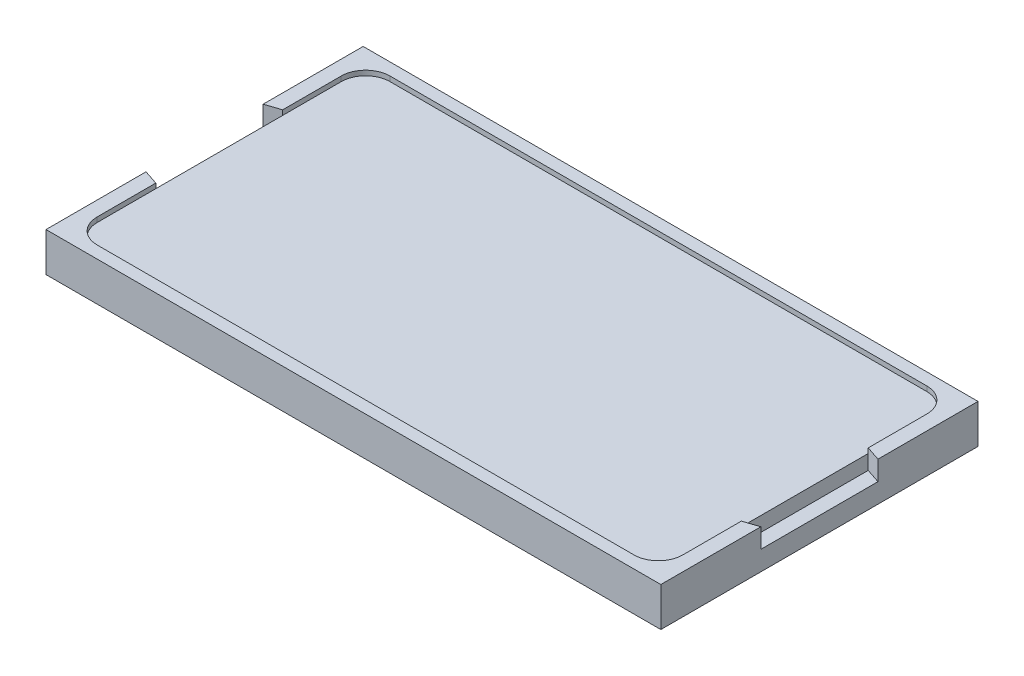
ISO-10303-21;
HEADER;
FILE_DESCRIPTION(('STEP AP214'),'2;1');
FILE_NAME('part.step','',(''),(''),'','','');
FILE_SCHEMA(('AUTOMOTIVE_DESIGN { 1 0 10303 214 1 1 1 1 }'));
ENDSEC;
DATA;
#1=APPLICATION_CONTEXT('core data for automotive mechanical design processes');
#2=APPLICATION_PROTOCOL_DEFINITION('international standard','automotive_design',2000,#1);
#3=PRODUCT_CONTEXT('',#1,'mechanical');
#4=PRODUCT('Part','Part','',(#3));
#5=PRODUCT_RELATED_PRODUCT_CATEGORY('part','',(#4));
#6=PRODUCT_DEFINITION_FORMATION('','',#4);
#7=PRODUCT_DEFINITION_CONTEXT('part definition',#1,'design');
#8=PRODUCT_DEFINITION('design','',#6,#7);
#9=PRODUCT_DEFINITION_SHAPE('','',#8);
#10=(LENGTH_UNIT() NAMED_UNIT(*) SI_UNIT(.MILLI.,.METRE.));
#11=(NAMED_UNIT(*) PLANE_ANGLE_UNIT() SI_UNIT($,.RADIAN.));
#12=(NAMED_UNIT(*) SI_UNIT($,.STERADIAN.) SOLID_ANGLE_UNIT());
#13=UNCERTAINTY_MEASURE_WITH_UNIT(LENGTH_MEASURE(1.E-05),#10,'distance_accuracy_value','');
#14=(GEOMETRIC_REPRESENTATION_CONTEXT(3) GLOBAL_UNCERTAINTY_ASSIGNED_CONTEXT((#13)) GLOBAL_UNIT_ASSIGNED_CONTEXT((#10,
#11,#12)) REPRESENTATION_CONTEXT('',''));
#15=CARTESIAN_POINT('',(0.,0.,0.));
#16=DIRECTION('',(0.,0.,1.));
#17=DIRECTION('',(1.,0.,0.));
#18=AXIS2_PLACEMENT_3D('',#15,#16,#17);
#19=CARTESIAN_POINT('',(0.,88.9,0.));
#20=DIRECTION('',(0.,1.,0.));
#21=DIRECTION('',(0.,0.,1.));
#22=AXIS2_PLACEMENT_3D('',#19,#20,#21);
#23=PLANE('',#22);
#24=CARTESIAN_POINT('',(698.5,88.9,317.5));
#25=DIRECTION('',(0.,1.,0.));
#26=DIRECTION('',(0.,0.,1.));
#27=AXIS2_PLACEMENT_3D('',#24,#25,#26);
#28=CIRCLE('',#27,63.5);
#29=CARTESIAN_POINT('',(698.5,88.9,381.));
#30=VERTEX_POINT('',#29);
#31=CARTESIAN_POINT('',(762.,88.9,317.5));
#32=VERTEX_POINT('',#31);
#33=EDGE_CURVE('E191',#30,#32,#28,.T.);
#34=ORIENTED_EDGE('',*,*,#33,.T.);
#35=DIRECTION('',(0.,0.,1.));
#36=VECTOR('',#35,1.);
#37=CARTESIAN_POINT('',(762.,88.9,-381.));
#38=LINE('',#37,#36);
#39=CARTESIAN_POINT('',(762.,88.9,165.1));
#40=VERTEX_POINT('',#39);
#41=EDGE_CURVE('E218',#40,#32,#38,.T.);
#42=ORIENTED_EDGE('',*,*,#41,.F.);
#43=CARTESIAN_POINT('',(762.,88.9,-165.1));
#44=VERTEX_POINT('',#43);
#45=EDGE_CURVE('E223',#44,#40,#38,.T.);
#46=ORIENTED_EDGE('',*,*,#45,.F.);
#47=CARTESIAN_POINT('',(762.,88.9,-317.5));
#48=VERTEX_POINT('',#47);
#49=EDGE_CURVE('E225',#48,#44,#38,.T.);
#50=ORIENTED_EDGE('',*,*,#49,.F.);
#51=CARTESIAN_POINT('',(698.5,88.9,-317.5));
#52=DIRECTION('',(0.,-1.,0.));
#53=DIRECTION('',(0.,0.,-1.));
#54=AXIS2_PLACEMENT_3D('',#51,#52,#53);
#55=CIRCLE('',#54,63.5);
#56=CARTESIAN_POINT('',(698.5,88.9,-381.));
#57=VERTEX_POINT('',#56);
#58=EDGE_CURVE('E437',#57,#48,#55,.T.);
#59=ORIENTED_EDGE('',*,*,#58,.F.);
#60=DIRECTION('',(1.,0.,0.));
#61=VECTOR('',#60,1.);
#62=CARTESIAN_POINT('',(-762.,88.9,-381.));
#63=LINE('',#62,#61);
#64=CARTESIAN_POINT('',(-698.5,88.9,-381.));
#65=VERTEX_POINT('',#64);
#66=EDGE_CURVE('E232',#65,#57,#63,.T.);
#67=ORIENTED_EDGE('',*,*,#66,.F.);
#68=CARTESIAN_POINT('',(-698.5,88.9,-317.5));
#69=DIRECTION('',(0.,1.,0.));
#70=DIRECTION('',(0.,0.,1.));
#71=AXIS2_PLACEMENT_3D('',#68,#69,#70);
#72=CIRCLE('',#71,63.5);
#73=CARTESIAN_POINT('',(-762.,88.9,-317.5));
#74=VERTEX_POINT('',#73);
#75=EDGE_CURVE('E424',#65,#74,#72,.T.);
#76=ORIENTED_EDGE('',*,*,#75,.T.);
#77=DIRECTION('',(0.,0.,1.));
#78=VECTOR('',#77,1.);
#79=CARTESIAN_POINT('',(-762.,88.9,-381.));
#80=LINE('',#79,#78);
#81=CARTESIAN_POINT('',(-762.,88.9,-165.1));
#82=VERTEX_POINT('',#81);
#83=EDGE_CURVE('E219',#74,#82,#80,.T.);
#84=ORIENTED_EDGE('',*,*,#83,.T.);
#85=CARTESIAN_POINT('',(-762.,88.9,165.1));
#86=VERTEX_POINT('',#85);
#87=EDGE_CURVE('E226',#82,#86,#80,.T.);
#88=ORIENTED_EDGE('',*,*,#87,.T.);
#89=CARTESIAN_POINT('',(-762.,88.9,317.5));
#90=VERTEX_POINT('',#89);
#91=EDGE_CURVE('E228',#86,#90,#80,.T.);
#92=ORIENTED_EDGE('',*,*,#91,.T.);
#93=CARTESIAN_POINT('',(-698.5,88.9,317.5));
#94=DIRECTION('',(0.,-1.,0.));
#95=DIRECTION('',(0.,0.,-1.));
#96=AXIS2_PLACEMENT_3D('',#93,#94,#95);
#97=CIRCLE('',#96,63.5);
#98=CARTESIAN_POINT('',(-698.5,88.9,381.));
#99=VERTEX_POINT('',#98);
#100=EDGE_CURVE('E216',#99,#90,#97,.T.);
#101=ORIENTED_EDGE('',*,*,#100,.F.);
#102=DIRECTION('',(1.,0.,0.));
#103=VECTOR('',#102,1.);
#104=CARTESIAN_POINT('',(-762.,88.9,381.));
#105=LINE('',#104,#103);
#106=EDGE_CURVE('E210',#99,#30,#105,.T.);
#107=ORIENTED_EDGE('',*,*,#106,.T.);
#108=EDGE_LOOP('',(#34,#42,#46,#50,#59,#67,#76,#84,#88,#92,#101,#107));
#109=FACE_BOUND('',#108,.T.);
#110=ADVANCED_FACE('F41',(#109),#23,.T.);
#111=CARTESIAN_POINT('',(-762.,88.9,381.));
#112=DIRECTION('',(0.,0.,1.));
#113=DIRECTION('',(1.,0.,0.));
#114=AXIS2_PLACEMENT_3D('',#111,#112,#113);
#115=PLANE('',#114);
#116=DIRECTION('',(0.,-1.,0.));
#117=VECTOR('',#116,1.);
#118=CARTESIAN_POINT('',(698.5,101.6,381.));
#119=LINE('',#118,#117);
#120=CARTESIAN_POINT('',(698.5,101.6,381.));
#121=VERTEX_POINT('',#120);
#122=EDGE_CURVE('E194',#121,#30,#119,.T.);
#123=ORIENTED_EDGE('',*,*,#122,.T.);
#124=ORIENTED_EDGE('',*,*,#106,.F.);
#125=DIRECTION('',(0.,-1.,0.));
#126=VECTOR('',#125,1.);
#127=CARTESIAN_POINT('',(-698.5,101.6,381.));
#128=LINE('',#127,#126);
#129=CARTESIAN_POINT('',(-698.5,101.6,381.));
#130=VERTEX_POINT('',#129);
#131=EDGE_CURVE('E65',#130,#99,#128,.T.);
#132=ORIENTED_EDGE('',*,*,#131,.F.);
#133=DIRECTION('',(1.,0.,0.));
#134=VECTOR('',#133,1.);
#135=CARTESIAN_POINT('',(-762.,101.6,381.));
#136=LINE('',#135,#134);
#137=EDGE_CURVE('E212',#130,#121,#136,.T.);
#138=ORIENTED_EDGE('',*,*,#137,.T.);
#139=EDGE_LOOP('',(#123,#124,#132,#138));
#140=FACE_BOUND('',#139,.T.);
#141=ADVANCED_FACE('F209',(#140),#115,.F.);
#142=CARTESIAN_POINT('',(762.,88.9,-381.));
#143=DIRECTION('',(-1.,0.,0.));
#144=DIRECTION('',(0.,0.,1.));
#145=AXIS2_PLACEMENT_3D('',#142,#143,#144);
#146=PLANE('',#145);
#147=ORIENTED_EDGE('',*,*,#41,.T.);
#148=DIRECTION('',(0.,-1.,0.));
#149=VECTOR('',#148,1.);
#150=CARTESIAN_POINT('',(762.,101.6,317.5));
#151=LINE('',#150,#149);
#152=CARTESIAN_POINT('',(762.,101.6,317.5));
#153=VERTEX_POINT('',#152);
#154=EDGE_CURVE('E197',#153,#32,#151,.T.);
#155=ORIENTED_EDGE('',*,*,#154,.F.);
#156=DIRECTION('',(0.,0.,1.));
#157=VECTOR('',#156,1.);
#158=CARTESIAN_POINT('',(762.,101.6,-381.));
#159=LINE('',#158,#157);
#160=CARTESIAN_POINT('',(762.,101.6,165.1));
#161=VERTEX_POINT('',#160);
#162=EDGE_CURVE('E243',#161,#153,#159,.T.);
#163=ORIENTED_EDGE('',*,*,#162,.F.);
#164=DIRECTION('',(0.,1.,0.));
#165=VECTOR('',#164,1.);
#166=CARTESIAN_POINT('',(762.,50.8,165.1));
#167=LINE('',#166,#165);
#168=EDGE_CURVE('E340',#40,#161,#167,.T.);
#169=ORIENTED_EDGE('',*,*,#168,.F.);
#170=EDGE_LOOP('',(#147,#155,#163,#169));
#171=FACE_BOUND('',#170,.T.);
#172=ADVANCED_FACE('F346',(#171),#146,.T.);
#173=CARTESIAN_POINT('',(762.,101.6,-317.5));
#174=VERTEX_POINT('',#173);
#175=CARTESIAN_POINT('',(762.,101.6,-165.1));
#176=VERTEX_POINT('',#175);
#177=EDGE_CURVE('E244',#174,#176,#159,.T.);
#178=ORIENTED_EDGE('',*,*,#177,.F.);
#179=DIRECTION('',(0.,-1.,0.));
#180=VECTOR('',#179,1.);
#181=CARTESIAN_POINT('',(762.,101.6,-317.5));
#182=LINE('',#181,#180);
#183=EDGE_CURVE('E443',#174,#48,#182,.T.);
#184=ORIENTED_EDGE('',*,*,#183,.T.);
#185=ORIENTED_EDGE('',*,*,#49,.T.);
#186=DIRECTION('',(0.,1.,0.));
#187=VECTOR('',#186,1.);
#188=CARTESIAN_POINT('',(762.,50.8,-165.1));
#189=LINE('',#188,#187);
#190=EDGE_CURVE('E349',#44,#176,#189,.T.);
#191=ORIENTED_EDGE('',*,*,#190,.T.);
#192=EDGE_LOOP('',(#178,#184,#185,#191));
#193=FACE_BOUND('',#192,.T.);
#194=ADVANCED_FACE('F492',(#193),#146,.T.);
#195=CARTESIAN_POINT('',(0.,101.6,0.));
#196=DIRECTION('',(0.,1.,0.));
#197=DIRECTION('',(0.,0.,1.));
#198=AXIS2_PLACEMENT_3D('',#195,#196,#197);
#199=PLANE('',#198);
#200=CARTESIAN_POINT('',(698.5,101.6,-317.5));
#201=DIRECTION('',(0.,-1.,0.));
#202=DIRECTION('',(0.,0.,-1.));
#203=AXIS2_PLACEMENT_3D('',#200,#201,#202);
#204=CIRCLE('',#203,63.5);
#205=CARTESIAN_POINT('',(698.5,101.6,-381.));
#206=VERTEX_POINT('',#205);
#207=EDGE_CURVE('E440',#206,#174,#204,.T.);
#208=ORIENTED_EDGE('',*,*,#207,.T.);
#209=ORIENTED_EDGE('',*,*,#177,.T.);
#210=DIRECTION('',(0.948683298050513,0.,0.316227766016841));
#211=VECTOR('',#210,1.);
#212=CARTESIAN_POINT('',(762.,101.6,-165.1));
#213=LINE('',#212,#211);
#214=CARTESIAN_POINT('',(800.1,101.6,-152.4));
#215=VERTEX_POINT('',#214);
#216=EDGE_CURVE('E371',#176,#215,#213,.T.);
#217=ORIENTED_EDGE('',*,*,#216,.T.);
#218=DIRECTION('',(0.,0.,-1.));
#219=VECTOR('',#218,1.);
#220=CARTESIAN_POINT('',(800.1,101.6,-412.75));
#221=LINE('',#220,#219);
#222=CARTESIAN_POINT('',(800.1,101.6,-412.75));
#223=VERTEX_POINT('',#222);
#224=EDGE_CURVE('E255',#215,#223,#221,.T.);
#225=ORIENTED_EDGE('',*,*,#224,.T.);
#226=DIRECTION('',(-1.,0.,0.));
#227=VECTOR('',#226,1.);
#228=CARTESIAN_POINT('',(-800.1,101.6,-412.75));
#229=LINE('',#228,#227);
#230=CARTESIAN_POINT('',(-800.1,101.6,-412.75));
#231=VERTEX_POINT('',#230);
#232=EDGE_CURVE('E254',#223,#231,#229,.T.);
#233=ORIENTED_EDGE('',*,*,#232,.T.);
#234=DIRECTION('',(0.,0.,1.));
#235=VECTOR('',#234,1.);
#236=CARTESIAN_POINT('',(-800.1,101.6,-412.75));
#237=LINE('',#236,#235);
#238=CARTESIAN_POINT('',(-800.1,101.6,-152.4));
#239=VERTEX_POINT('',#238);
#240=EDGE_CURVE('E259',#231,#239,#237,.T.);
#241=ORIENTED_EDGE('',*,*,#240,.T.);
#242=DIRECTION('',(-0.948683298050515,0.,0.316227766016833));
#243=VECTOR('',#242,1.);
#244=CARTESIAN_POINT('',(-800.1,101.6,-152.4));
#245=LINE('',#244,#243);
#246=CARTESIAN_POINT('',(-762.,101.6,-165.1));
#247=VERTEX_POINT('',#246);
#248=EDGE_CURVE('E396',#247,#239,#245,.T.);
#249=ORIENTED_EDGE('',*,*,#248,.F.);
#250=DIRECTION('',(0.,0.,1.));
#251=VECTOR('',#250,1.);
#252=CARTESIAN_POINT('',(-762.,101.6,-381.));
#253=LINE('',#252,#251);
#254=CARTESIAN_POINT('',(-762.,101.6,-317.5));
#255=VERTEX_POINT('',#254);
#256=EDGE_CURVE('E237',#255,#247,#253,.T.);
#257=ORIENTED_EDGE('',*,*,#256,.F.);
#258=CARTESIAN_POINT('',(-698.5,101.6,-317.5));
#259=DIRECTION('',(0.,1.,0.));
#260=DIRECTION('',(0.,0.,1.));
#261=AXIS2_PLACEMENT_3D('',#258,#259,#260);
#262=CIRCLE('',#261,63.5);
#263=CARTESIAN_POINT('',(-698.5,101.6,-381.));
#264=VERTEX_POINT('',#263);
#265=EDGE_CURVE('E57',#264,#255,#262,.T.);
#266=ORIENTED_EDGE('',*,*,#265,.F.);
#267=DIRECTION('',(1.,0.,0.));
#268=VECTOR('',#267,1.);
#269=CARTESIAN_POINT('',(-762.,101.6,-381.));
#270=LINE('',#269,#268);
#271=EDGE_CURVE('E247',#264,#206,#270,.T.);
#272=ORIENTED_EDGE('',*,*,#271,.T.);
#273=EDGE_LOOP('',(#208,#209,#217,#225,#233,#241,#249,#257,#266,#272));
#274=FACE_BOUND('',#273,.T.);
#275=ADVANCED_FACE('F466',(#274),#199,.T.);
#276=CARTESIAN_POINT('',(-762.,88.9,-381.));
#277=DIRECTION('',(-1.,0.,0.));
#278=DIRECTION('',(0.,0.,1.));
#279=AXIS2_PLACEMENT_3D('',#276,#277,#278);
#280=PLANE('',#279);
#281=ORIENTED_EDGE('',*,*,#83,.F.);
#282=DIRECTION('',(0.,-1.,0.));
#283=VECTOR('',#282,1.);
#284=CARTESIAN_POINT('',(-762.,101.6,-317.5));
#285=LINE('',#284,#283);
#286=EDGE_CURVE('E429',#255,#74,#285,.T.);
#287=ORIENTED_EDGE('',*,*,#286,.F.);
#288=ORIENTED_EDGE('',*,*,#256,.T.);
#289=DIRECTION('',(0.,1.,0.));
#290=VECTOR('',#289,1.);
#291=CARTESIAN_POINT('',(-762.,50.8,-165.1));
#292=LINE('',#291,#290);
#293=EDGE_CURVE('E389',#82,#247,#292,.T.);
#294=ORIENTED_EDGE('',*,*,#293,.F.);
#295=EDGE_LOOP('',(#281,#287,#288,#294));
#296=FACE_BOUND('',#295,.T.);
#297=ADVANCED_FACE('F475',(#296),#280,.F.);
#298=CARTESIAN_POINT('',(800.1,101.6,-412.75));
#299=DIRECTION('',(-1.,0.,0.));
#300=DIRECTION('',(0.,0.,1.));
#301=AXIS2_PLACEMENT_3D('',#298,#299,#300);
#302=PLANE('',#301);
#303=DIRECTION('',(0.,0.,-1.));
#304=VECTOR('',#303,1.);
#305=CARTESIAN_POINT('',(800.1,50.8,152.4));
#306=LINE('',#305,#304);
#307=CARTESIAN_POINT('',(800.1,50.8,152.4));
#308=VERTEX_POINT('',#307);
#309=CARTESIAN_POINT('',(800.1,50.8,-152.4));
#310=VERTEX_POINT('',#309);
#311=EDGE_CURVE('E375',#308,#310,#306,.T.);
#312=ORIENTED_EDGE('',*,*,#311,.F.);
#313=DIRECTION('',(0.,1.,0.));
#314=VECTOR('',#313,1.);
#315=CARTESIAN_POINT('',(800.1,50.8,152.4));
#316=LINE('',#315,#314);
#317=CARTESIAN_POINT('',(800.1,101.6,152.4));
#318=VERTEX_POINT('',#317);
#319=EDGE_CURVE('E310',#308,#318,#316,.T.);
#320=ORIENTED_EDGE('',*,*,#319,.T.);
#321=CARTESIAN_POINT('',(800.1,101.6,412.75));
#322=VERTEX_POINT('',#321);
#323=EDGE_CURVE('E250',#322,#318,#221,.T.);
#324=ORIENTED_EDGE('',*,*,#323,.F.);
#325=DIRECTION('',(0.,-1.,0.));
#326=VECTOR('',#325,1.);
#327=CARTESIAN_POINT('',(800.1,101.6,412.75));
#328=LINE('',#327,#326);
#329=CARTESIAN_POINT('',(800.1,0.,412.75));
#330=VERTEX_POINT('',#329);
#331=EDGE_CURVE('E266',#322,#330,#328,.T.);
#332=ORIENTED_EDGE('',*,*,#331,.T.);
#333=DIRECTION('',(0.,0.,-1.));
#334=VECTOR('',#333,1.);
#335=CARTESIAN_POINT('',(800.1,0.,-412.75));
#336=LINE('',#335,#334);
#337=CARTESIAN_POINT('',(800.1,0.,-412.75));
#338=VERTEX_POINT('',#337);
#339=EDGE_CURVE('E236',#330,#338,#336,.T.);
#340=ORIENTED_EDGE('',*,*,#339,.T.);
#341=DIRECTION('',(0.,-1.,0.));
#342=VECTOR('',#341,1.);
#343=CARTESIAN_POINT('',(800.1,101.6,-412.75));
#344=LINE('',#343,#342);
#345=EDGE_CURVE('E11',#223,#338,#344,.T.);
#346=ORIENTED_EDGE('',*,*,#345,.F.);
#347=ORIENTED_EDGE('',*,*,#224,.F.);
#348=DIRECTION('',(0.,1.,0.));
#349=VECTOR('',#348,1.);
#350=CARTESIAN_POINT('',(800.1,50.8,-152.4));
#351=LINE('',#350,#349);
#352=EDGE_CURVE('E353',#310,#215,#351,.T.);
#353=ORIENTED_EDGE('',*,*,#352,.F.);
#354=EDGE_LOOP('',(#312,#320,#324,#332,#340,#346,#347,#353));
#355=FACE_BOUND('',#354,.T.);
#356=ADVANCED_FACE('F43',(#355),#302,.F.);
#357=CARTESIAN_POINT('',(-800.1,101.6,-412.75));
#358=DIRECTION('',(0.,0.,1.));
#359=DIRECTION('',(1.,0.,0.));
#360=AXIS2_PLACEMENT_3D('',#357,#358,#359);
#361=PLANE('',#360);
#362=DIRECTION('',(-1.,0.,0.));
#363=VECTOR('',#362,1.);
#364=CARTESIAN_POINT('',(-800.1,0.,-412.75));
#365=LINE('',#364,#363);
#366=CARTESIAN_POINT('',(-800.1,0.,-412.75));
#367=VERTEX_POINT('',#366);
#368=EDGE_CURVE('E270',#338,#367,#365,.T.);
#369=ORIENTED_EDGE('',*,*,#368,.T.);
#370=DIRECTION('',(0.,-1.,0.));
#371=VECTOR('',#370,1.);
#372=CARTESIAN_POINT('',(-800.1,101.6,-412.75));
#373=LINE('',#372,#371);
#374=EDGE_CURVE('E50',#231,#367,#373,.T.);
#375=ORIENTED_EDGE('',*,*,#374,.F.);
#376=ORIENTED_EDGE('',*,*,#232,.F.);
#377=ORIENTED_EDGE('',*,*,#345,.T.);
#378=EDGE_LOOP('',(#369,#375,#376,#377));
#379=FACE_BOUND('',#378,.T.);
#380=ADVANCED_FACE('F468',(#379),#361,.F.);
#381=CARTESIAN_POINT('',(-800.1,101.6,-412.75));
#382=DIRECTION('',(1.,0.,0.));
#383=DIRECTION('',(0.,0.,-1.));
#384=AXIS2_PLACEMENT_3D('',#381,#382,#383);
#385=PLANE('',#384);
#386=DIRECTION('',(0.,0.,1.));
#387=VECTOR('',#386,1.);
#388=CARTESIAN_POINT('',(-800.1,50.8,-2.22044604925031E-13));
#389=LINE('',#388,#387);
#390=CARTESIAN_POINT('',(-800.1,50.8,-152.4));
#391=VERTEX_POINT('',#390);
#392=CARTESIAN_POINT('',(-800.1,50.8,152.4));
#393=VERTEX_POINT('',#392);
#394=EDGE_CURVE('E399',#391,#393,#389,.T.);
#395=ORIENTED_EDGE('',*,*,#394,.F.);
#396=DIRECTION('',(0.,1.,0.));
#397=VECTOR('',#396,1.);
#398=CARTESIAN_POINT('',(-800.1,50.8,-152.4));
#399=LINE('',#398,#397);
#400=EDGE_CURVE('E373',#391,#239,#399,.T.);
#401=ORIENTED_EDGE('',*,*,#400,.T.);
#402=ORIENTED_EDGE('',*,*,#240,.F.);
#403=ORIENTED_EDGE('',*,*,#374,.T.);
#404=DIRECTION('',(0.,0.,1.));
#405=VECTOR('',#404,1.);
#406=CARTESIAN_POINT('',(-800.1,0.,-412.75));
#407=LINE('',#406,#405);
#408=CARTESIAN_POINT('',(-800.1,0.,412.75));
#409=VERTEX_POINT('',#408);
#410=EDGE_CURVE('E273',#367,#409,#407,.T.);
#411=ORIENTED_EDGE('',*,*,#410,.T.);
#412=DIRECTION('',(0.,-1.,0.));
#413=VECTOR('',#412,1.);
#414=CARTESIAN_POINT('',(-800.1,101.6,412.75));
#415=LINE('',#414,#413);
#416=CARTESIAN_POINT('',(-800.1,101.6,412.75));
#417=VERTEX_POINT('',#416);
#418=EDGE_CURVE('E282',#417,#409,#415,.T.);
#419=ORIENTED_EDGE('',*,*,#418,.F.);
#420=CARTESIAN_POINT('',(-800.1,101.6,152.4));
#421=VERTEX_POINT('',#420);
#422=EDGE_CURVE('E258',#421,#417,#237,.T.);
#423=ORIENTED_EDGE('',*,*,#422,.F.);
#424=DIRECTION('',(0.,1.,0.));
#425=VECTOR('',#424,1.);
#426=CARTESIAN_POINT('',(-800.1,50.8,152.4));
#427=LINE('',#426,#425);
#428=EDGE_CURVE('E381',#393,#421,#427,.T.);
#429=ORIENTED_EDGE('',*,*,#428,.F.);
#430=EDGE_LOOP('',(#395,#401,#402,#403,#411,#419,#423,#429));
#431=FACE_BOUND('',#430,.T.);
#432=ADVANCED_FACE('F292',(#431),#385,.F.);
#433=CARTESIAN_POINT('',(-800.1,101.6,412.75));
#434=DIRECTION('',(0.,0.,-1.));
#435=DIRECTION('',(-1.,0.,0.));
#436=AXIS2_PLACEMENT_3D('',#433,#434,#435);
#437=PLANE('',#436);
#438=DIRECTION('',(1.,0.,0.));
#439=VECTOR('',#438,1.);
#440=CARTESIAN_POINT('',(-800.1,0.,412.75));
#441=LINE('',#440,#439);
#442=EDGE_CURVE('E276',#409,#330,#441,.T.);
#443=ORIENTED_EDGE('',*,*,#442,.T.);
#444=ORIENTED_EDGE('',*,*,#331,.F.);
#445=DIRECTION('',(1.,0.,0.));
#446=VECTOR('',#445,1.);
#447=CARTESIAN_POINT('',(-800.1,101.6,412.75));
#448=LINE('',#447,#446);
#449=EDGE_CURVE('E263',#417,#322,#448,.T.);
#450=ORIENTED_EDGE('',*,*,#449,.F.);
#451=ORIENTED_EDGE('',*,*,#418,.T.);
#452=EDGE_LOOP('',(#443,#444,#450,#451));
#453=FACE_BOUND('',#452,.T.);
#454=ADVANCED_FACE('F303',(#453),#437,.F.);
#455=CARTESIAN_POINT('',(-698.5,101.6,317.5));
#456=DIRECTION('',(0.,-1.,0.));
#457=DIRECTION('',(0.,0.,-1.));
#458=AXIS2_PLACEMENT_3D('',#455,#456,#457);
#459=CIRCLE('',#458,63.5);
#460=CARTESIAN_POINT('',(-762.,101.6,317.5));
#461=VERTEX_POINT('',#460);
#462=EDGE_CURVE('E419',#130,#461,#459,.T.);
#463=ORIENTED_EDGE('',*,*,#462,.T.);
#464=CARTESIAN_POINT('',(-762.,101.6,165.1));
#465=VERTEX_POINT('',#464);
#466=EDGE_CURVE('E240',#465,#461,#253,.T.);
#467=ORIENTED_EDGE('',*,*,#466,.F.);
#468=DIRECTION('',(0.948683298050515,0.,0.316227766016835));
#469=VECTOR('',#468,1.);
#470=CARTESIAN_POINT('',(-800.1,101.6,152.4));
#471=LINE('',#470,#469);
#472=EDGE_CURVE('E320',#421,#465,#471,.T.);
#473=ORIENTED_EDGE('',*,*,#472,.F.);
#474=ORIENTED_EDGE('',*,*,#422,.T.);
#475=ORIENTED_EDGE('',*,*,#449,.T.);
#476=ORIENTED_EDGE('',*,*,#323,.T.);
#477=DIRECTION('',(0.948683298050513,0.,-0.316227766016841));
#478=VECTOR('',#477,1.);
#479=CARTESIAN_POINT('',(762.,101.6,165.1));
#480=LINE('',#479,#478);
#481=EDGE_CURVE('E315',#161,#318,#480,.T.);
#482=ORIENTED_EDGE('',*,*,#481,.F.);
#483=ORIENTED_EDGE('',*,*,#162,.T.);
#484=CARTESIAN_POINT('',(698.5,101.6,317.5));
#485=DIRECTION('',(0.,1.,0.));
#486=DIRECTION('',(0.,0.,1.));
#487=AXIS2_PLACEMENT_3D('',#484,#485,#486);
#488=CIRCLE('',#487,63.5);
#489=EDGE_CURVE('E204',#121,#153,#488,.T.);
#490=ORIENTED_EDGE('',*,*,#489,.F.);
#491=ORIENTED_EDGE('',*,*,#137,.F.);
#492=EDGE_LOOP('',(#463,#467,#473,#474,#475,#476,#482,#483,#490,#491));
#493=FACE_BOUND('',#492,.T.);
#494=ADVANCED_FACE('F313',(#493),#199,.T.);
#495=CARTESIAN_POINT('',(0.,0.,0.));
#496=DIRECTION('',(0.,1.,0.));
#497=DIRECTION('',(0.,0.,1.));
#498=AXIS2_PLACEMENT_3D('',#495,#496,#497);
#499=PLANE('',#498);
#500=ORIENTED_EDGE('',*,*,#339,.F.);
#501=ORIENTED_EDGE('',*,*,#442,.F.);
#502=ORIENTED_EDGE('',*,*,#410,.F.);
#503=ORIENTED_EDGE('',*,*,#368,.F.);
#504=EDGE_LOOP('',(#500,#501,#502,#503));
#505=FACE_BOUND('',#504,.T.);
#506=ADVANCED_FACE('F300',(#505),#499,.F.);
#507=ORIENTED_EDGE('',*,*,#466,.T.);
#508=DIRECTION('',(0.,-1.,0.));
#509=VECTOR('',#508,1.);
#510=CARTESIAN_POINT('',(-762.,101.6,317.5));
#511=LINE('',#510,#509);
#512=EDGE_CURVE('E415',#461,#90,#511,.T.);
#513=ORIENTED_EDGE('',*,*,#512,.T.);
#514=ORIENTED_EDGE('',*,*,#91,.F.);
#515=DIRECTION('',(0.,1.,0.));
#516=VECTOR('',#515,1.);
#517=CARTESIAN_POINT('',(-762.,50.8,165.1));
#518=LINE('',#517,#516);
#519=EDGE_CURVE('E384',#86,#465,#518,.T.);
#520=ORIENTED_EDGE('',*,*,#519,.T.);
#521=EDGE_LOOP('',(#507,#513,#514,#520));
#522=FACE_BOUND('',#521,.T.);
#523=ADVANCED_FACE('F489',(#522),#280,.F.);
#524=CARTESIAN_POINT('',(-762.,88.9,-381.));
#525=DIRECTION('',(0.,0.,1.));
#526=DIRECTION('',(1.,0.,0.));
#527=AXIS2_PLACEMENT_3D('',#524,#525,#526);
#528=PLANE('',#527);
#529=DIRECTION('',(0.,-1.,0.));
#530=VECTOR('',#529,1.);
#531=CARTESIAN_POINT('',(698.5,101.6,-381.));
#532=LINE('',#531,#530);
#533=EDGE_CURVE('E203',#206,#57,#532,.T.);
#534=ORIENTED_EDGE('',*,*,#533,.F.);
#535=ORIENTED_EDGE('',*,*,#271,.F.);
#536=DIRECTION('',(0.,-1.,0.));
#537=VECTOR('',#536,1.);
#538=CARTESIAN_POINT('',(-698.5,101.6,-381.));
#539=LINE('',#538,#537);
#540=EDGE_CURVE('E433',#264,#65,#539,.T.);
#541=ORIENTED_EDGE('',*,*,#540,.T.);
#542=ORIENTED_EDGE('',*,*,#66,.T.);
#543=EDGE_LOOP('',(#534,#535,#541,#542));
#544=FACE_BOUND('',#543,.T.);
#545=ADVANCED_FACE('F486',(#544),#528,.T.);
#546=CARTESIAN_POINT('',(762.,50.8,165.1));
#547=DIRECTION('',(0.316227766016841,0.,0.948683298050513));
#548=DIRECTION('',(0.948683298050513,0.,-0.316227766016841));
#549=AXIS2_PLACEMENT_3D('',#546,#547,#548);
#550=PLANE('',#549);
#551=ORIENTED_EDGE('',*,*,#481,.T.);
#552=ORIENTED_EDGE('',*,*,#319,.F.);
#553=DIRECTION('',(0.948683298050513,0.,-0.316227766016841));
#554=VECTOR('',#553,1.);
#555=CARTESIAN_POINT('',(762.,50.8,165.1));
#556=LINE('',#555,#554);
#557=CARTESIAN_POINT('',(762.,50.8,165.1));
#558=VERTEX_POINT('',#557);
#559=EDGE_CURVE('E342',#558,#308,#556,.T.);
#560=ORIENTED_EDGE('',*,*,#559,.F.);
#561=EDGE_CURVE('E331',#558,#40,#167,.T.);
#562=ORIENTED_EDGE('',*,*,#561,.T.);
#563=ORIENTED_EDGE('',*,*,#168,.T.);
#564=EDGE_LOOP('',(#551,#552,#560,#562,#563));
#565=FACE_BOUND('',#564,.T.);
#566=ADVANCED_FACE('F339',(#565),#550,.F.);
#567=CARTESIAN_POINT('',(762.,50.8,0.));
#568=DIRECTION('',(-1.,0.,0.));
#569=DIRECTION('',(0.,0.,1.));
#570=AXIS2_PLACEMENT_3D('',#567,#568,#569);
#571=PLANE('',#570);
#572=ORIENTED_EDGE('',*,*,#45,.T.);
#573=ORIENTED_EDGE('',*,*,#561,.F.);
#574=DIRECTION('',(0.,0.,-1.));
#575=VECTOR('',#574,1.);
#576=CARTESIAN_POINT('',(762.,50.8,0.));
#577=LINE('',#576,#575);
#578=CARTESIAN_POINT('',(762.,50.8,-165.1));
#579=VERTEX_POINT('',#578);
#580=EDGE_CURVE('E363',#558,#579,#577,.T.);
#581=ORIENTED_EDGE('',*,*,#580,.T.);
#582=EDGE_CURVE('E334',#579,#44,#189,.T.);
#583=ORIENTED_EDGE('',*,*,#582,.T.);
#584=EDGE_LOOP('',(#572,#573,#581,#583));
#585=FACE_BOUND('',#584,.T.);
#586=ADVANCED_FACE('F330',(#585),#571,.F.);
#587=CARTESIAN_POINT('',(762.,50.8,-165.1));
#588=DIRECTION('',(-0.316227766016841,0.,0.948683298050513));
#589=DIRECTION('',(0.948683298050513,0.,0.316227766016841));
#590=AXIS2_PLACEMENT_3D('',#587,#588,#589);
#591=PLANE('',#590);
#592=ORIENTED_EDGE('',*,*,#216,.F.);
#593=ORIENTED_EDGE('',*,*,#190,.F.);
#594=ORIENTED_EDGE('',*,*,#582,.F.);
#595=DIRECTION('',(0.948683298050513,0.,0.316227766016841));
#596=VECTOR('',#595,1.);
#597=CARTESIAN_POINT('',(762.,50.8,-165.1));
#598=LINE('',#597,#596);
#599=EDGE_CURVE('E367',#579,#310,#598,.T.);
#600=ORIENTED_EDGE('',*,*,#599,.T.);
#601=ORIENTED_EDGE('',*,*,#352,.T.);
#602=EDGE_LOOP('',(#592,#593,#594,#600,#601));
#603=FACE_BOUND('',#602,.T.);
#604=ADVANCED_FACE('F484',(#603),#591,.T.);
#605=CARTESIAN_POINT('',(0.,50.8,0.));
#606=DIRECTION('',(0.,-1.,0.));
#607=DIRECTION('',(0.,0.,-1.));
#608=AXIS2_PLACEMENT_3D('',#605,#606,#607);
#609=PLANE('',#608);
#610=ORIENTED_EDGE('',*,*,#311,.T.);
#611=ORIENTED_EDGE('',*,*,#599,.F.);
#612=ORIENTED_EDGE('',*,*,#580,.F.);
#613=ORIENTED_EDGE('',*,*,#559,.T.);
#614=EDGE_LOOP('',(#610,#611,#612,#613));
#615=FACE_BOUND('',#614,.T.);
#616=ADVANCED_FACE('F544',(#615),#609,.F.);
#617=CARTESIAN_POINT('',(-800.1,50.8,-152.4));
#618=DIRECTION('',(-0.316227766016833,0.,-0.948683298050515));
#619=DIRECTION('',(-0.948683298050516,0.,0.316227766016833));
#620=AXIS2_PLACEMENT_3D('',#617,#618,#619);
#621=PLANE('',#620);
#622=ORIENTED_EDGE('',*,*,#248,.T.);
#623=ORIENTED_EDGE('',*,*,#400,.F.);
#624=DIRECTION('',(-0.948683298050515,0.,0.316227766016833));
#625=VECTOR('',#624,1.);
#626=CARTESIAN_POINT('',(-800.1,50.8,-152.4));
#627=LINE('',#626,#625);
#628=CARTESIAN_POINT('',(-762.,50.8,-165.1));
#629=VERTEX_POINT('',#628);
#630=EDGE_CURVE('E385',#629,#391,#627,.T.);
#631=ORIENTED_EDGE('',*,*,#630,.F.);
#632=EDGE_CURVE('E390',#629,#82,#292,.T.);
#633=ORIENTED_EDGE('',*,*,#632,.T.);
#634=ORIENTED_EDGE('',*,*,#293,.T.);
#635=EDGE_LOOP('',(#622,#623,#631,#633,#634));
#636=FACE_BOUND('',#635,.T.);
#637=ADVANCED_FACE('F461',(#636),#621,.F.);
#638=CARTESIAN_POINT('',(-762.,50.8,0.));
#639=DIRECTION('',(1.,0.,0.));
#640=DIRECTION('',(0.,0.,-1.));
#641=AXIS2_PLACEMENT_3D('',#638,#639,#640);
#642=PLANE('',#641);
#643=ORIENTED_EDGE('',*,*,#87,.F.);
#644=ORIENTED_EDGE('',*,*,#632,.F.);
#645=DIRECTION('',(0.,0.,-1.));
#646=VECTOR('',#645,1.);
#647=CARTESIAN_POINT('',(-762.,50.8,0.));
#648=LINE('',#647,#646);
#649=CARTESIAN_POINT('',(-762.,50.8,165.1));
#650=VERTEX_POINT('',#649);
#651=EDGE_CURVE('E405',#650,#629,#648,.T.);
#652=ORIENTED_EDGE('',*,*,#651,.F.);
#653=EDGE_CURVE('E386',#650,#86,#518,.T.);
#654=ORIENTED_EDGE('',*,*,#653,.T.);
#655=EDGE_LOOP('',(#643,#644,#652,#654));
#656=FACE_BOUND('',#655,.T.);
#657=ADVANCED_FACE('F557',(#656),#642,.F.);
#658=CARTESIAN_POINT('',(-800.1,50.8,152.4));
#659=DIRECTION('',(-0.316227766016835,0.,0.948683298050515));
#660=DIRECTION('',(0.948683298050515,0.,0.316227766016835));
#661=AXIS2_PLACEMENT_3D('',#658,#659,#660);
#662=PLANE('',#661);
#663=ORIENTED_EDGE('',*,*,#472,.T.);
#664=ORIENTED_EDGE('',*,*,#519,.F.);
#665=ORIENTED_EDGE('',*,*,#653,.F.);
#666=DIRECTION('',(0.948683298050515,0.,0.316227766016835));
#667=VECTOR('',#666,1.);
#668=CARTESIAN_POINT('',(-800.1,50.8,152.4));
#669=LINE('',#668,#667);
#670=EDGE_CURVE('E408',#393,#650,#669,.T.);
#671=ORIENTED_EDGE('',*,*,#670,.F.);
#672=ORIENTED_EDGE('',*,*,#428,.T.);
#673=EDGE_LOOP('',(#663,#664,#665,#671,#672));
#674=FACE_BOUND('',#673,.T.);
#675=ADVANCED_FACE('F565',(#674),#662,.F.);
#676=CARTESIAN_POINT('',(0.,50.8,0.));
#677=DIRECTION('',(0.,1.,0.));
#678=DIRECTION('',(0.,0.,1.));
#679=AXIS2_PLACEMENT_3D('',#676,#677,#678);
#680=PLANE('',#679);
#681=ORIENTED_EDGE('',*,*,#394,.T.);
#682=ORIENTED_EDGE('',*,*,#670,.T.);
#683=ORIENTED_EDGE('',*,*,#651,.T.);
#684=ORIENTED_EDGE('',*,*,#630,.T.);
#685=EDGE_LOOP('',(#681,#682,#683,#684));
#686=FACE_BOUND('',#685,.T.);
#687=ADVANCED_FACE('F573',(#686),#680,.T.);
#688=CARTESIAN_POINT('',(-698.5,101.6,317.5));
#689=DIRECTION('',(0.,-1.,0.));
#690=DIRECTION('',(0.,0.,-1.));
#691=AXIS2_PLACEMENT_3D('',#688,#689,#690);
#692=CYLINDRICAL_SURFACE('',#691,63.5);
#693=ORIENTED_EDGE('',*,*,#100,.T.);
#694=ORIENTED_EDGE('',*,*,#512,.F.);
#695=ORIENTED_EDGE('',*,*,#462,.F.);
#696=ORIENTED_EDGE('',*,*,#131,.T.);
#697=EDGE_LOOP('',(#693,#694,#695,#696));
#698=FACE_BOUND('',#697,.T.);
#699=ADVANCED_FACE('F580',(#698),#692,.F.);
#700=CARTESIAN_POINT('',(-698.5,101.6,-317.5));
#701=DIRECTION('',(0.,-1.,0.));
#702=DIRECTION('',(0.,0.,-1.));
#703=AXIS2_PLACEMENT_3D('',#700,#701,#702);
#704=CYLINDRICAL_SURFACE('',#703,63.5);
#705=ORIENTED_EDGE('',*,*,#75,.F.);
#706=ORIENTED_EDGE('',*,*,#540,.F.);
#707=ORIENTED_EDGE('',*,*,#265,.T.);
#708=ORIENTED_EDGE('',*,*,#286,.T.);
#709=EDGE_LOOP('',(#705,#706,#707,#708));
#710=FACE_BOUND('',#709,.T.);
#711=ADVANCED_FACE('F589',(#710),#704,.F.);
#712=CARTESIAN_POINT('',(698.5,101.6,-317.5));
#713=DIRECTION('',(0.,-1.,0.));
#714=DIRECTION('',(0.,0.,-1.));
#715=AXIS2_PLACEMENT_3D('',#712,#713,#714);
#716=CYLINDRICAL_SURFACE('',#715,63.5);
#717=ORIENTED_EDGE('',*,*,#58,.T.);
#718=ORIENTED_EDGE('',*,*,#183,.F.);
#719=ORIENTED_EDGE('',*,*,#207,.F.);
#720=ORIENTED_EDGE('',*,*,#533,.T.);
#721=EDGE_LOOP('',(#717,#718,#719,#720));
#722=FACE_BOUND('',#721,.T.);
#723=ADVANCED_FACE('F596',(#722),#716,.F.);
#724=CARTESIAN_POINT('',(698.5,101.6,317.5));
#725=DIRECTION('',(0.,-1.,0.));
#726=DIRECTION('',(0.,0.,-1.));
#727=AXIS2_PLACEMENT_3D('',#724,#725,#726);
#728=CYLINDRICAL_SURFACE('',#727,63.5);
#729=ORIENTED_EDGE('',*,*,#33,.F.);
#730=ORIENTED_EDGE('',*,*,#122,.F.);
#731=ORIENTED_EDGE('',*,*,#489,.T.);
#732=ORIENTED_EDGE('',*,*,#154,.T.);
#733=EDGE_LOOP('',(#729,#730,#731,#732));
#734=FACE_BOUND('',#733,.T.);
#735=ADVANCED_FACE('F193',(#734),#728,.F.);
#736=CLOSED_SHELL('',(#110,#141,#172,#194,#275,#297,#356,#380,#432,#454,#494,#506,#523,#545,
#566,#586,#604,#616,#637,#657,#675,#687,#699,#711,#723,#735));
#737=MANIFOLD_SOLID_BREP('B2',#736);
#738=ADVANCED_BREP_SHAPE_REPRESENTATION('',(#18,#737),#14);
#739=SHAPE_DEFINITION_REPRESENTATION(#9,#738);
ENDSEC;
END-ISO-10303-21;
